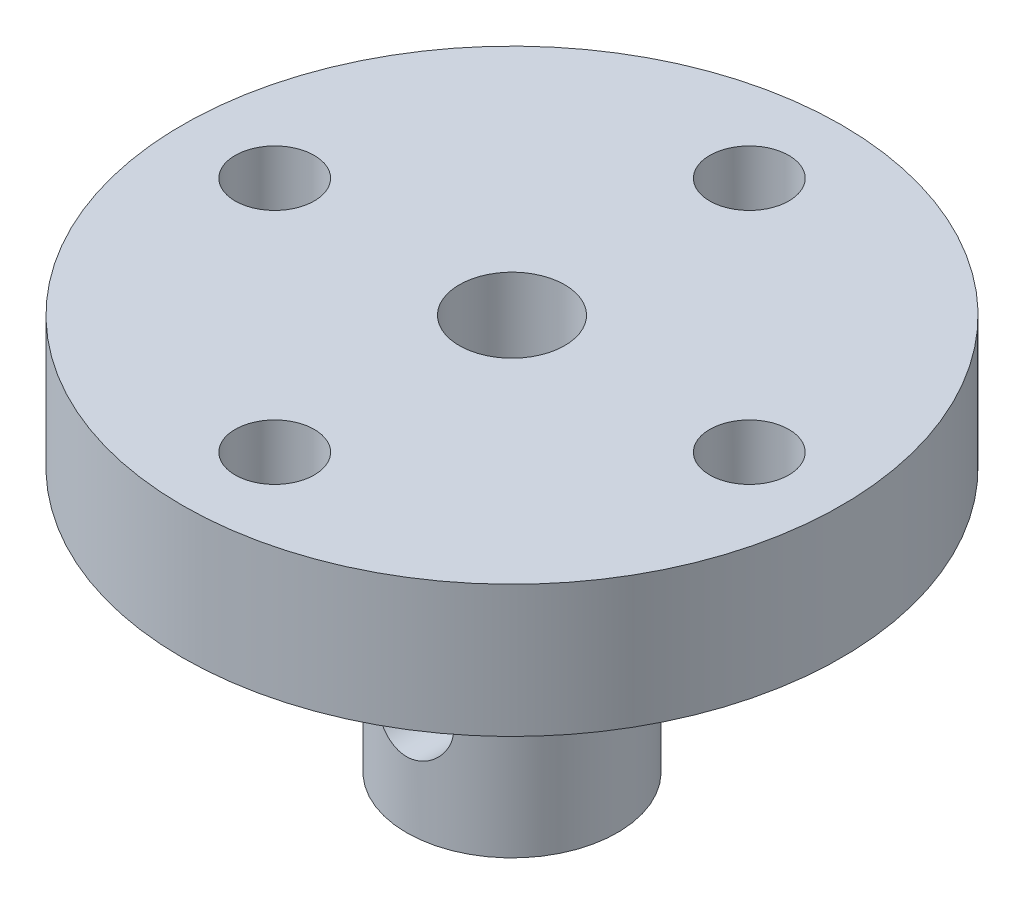
ISO-10303-21;
HEADER;
FILE_DESCRIPTION(('STEP AP214'),'2;1');
FILE_NAME('part.step','',(''),(''),'','','');
FILE_SCHEMA(('AUTOMOTIVE_DESIGN { 1 0 10303 214 1 1 1 1 }'));
ENDSEC;
DATA;
#1=APPLICATION_CONTEXT('core data for automotive mechanical design processes');
#2=APPLICATION_PROTOCOL_DEFINITION('international standard','automotive_design',2000,#1);
#3=PRODUCT_CONTEXT('',#1,'mechanical');
#4=PRODUCT('Part','Part','',(#3));
#5=PRODUCT_RELATED_PRODUCT_CATEGORY('part','',(#4));
#6=PRODUCT_DEFINITION_FORMATION('','',#4);
#7=PRODUCT_DEFINITION_CONTEXT('part definition',#1,'design');
#8=PRODUCT_DEFINITION('design','',#6,#7);
#9=PRODUCT_DEFINITION_SHAPE('','',#8);
#10=(LENGTH_UNIT() NAMED_UNIT(*) SI_UNIT(.MILLI.,.METRE.));
#11=(NAMED_UNIT(*) PLANE_ANGLE_UNIT() SI_UNIT($,.RADIAN.));
#12=(NAMED_UNIT(*) SI_UNIT($,.STERADIAN.) SOLID_ANGLE_UNIT());
#13=UNCERTAINTY_MEASURE_WITH_UNIT(LENGTH_MEASURE(1.E-05),#10,'distance_accuracy_value','');
#14=(GEOMETRIC_REPRESENTATION_CONTEXT(3) GLOBAL_UNCERTAINTY_ASSIGNED_CONTEXT((#13)) GLOBAL_UNIT_ASSIGNED_CONTEXT((#10,
#11,#12)) REPRESENTATION_CONTEXT('',''));
#15=CARTESIAN_POINT('',(0.,0.,0.));
#16=DIRECTION('',(0.,0.,1.));
#17=DIRECTION('',(1.,0.,0.));
#18=AXIS2_PLACEMENT_3D('',#15,#16,#17);
#19=CARTESIAN_POINT('',(0.,4.,-4.));
#20=DIRECTION('',(0.,0.,-1.));
#21=DIRECTION('',(-1.,0.,0.));
#22=AXIS2_PLACEMENT_3D('',#19,#20,#21);
#23=CYLINDRICAL_SURFACE('',#22,1.49999999999999);
#24=CARTESIAN_POINT('',(-1.49999999999999,4.,1.3228756555323));
#25=CARTESIAN_POINT('',(-1.49999219049447,4.06999742342563,1.32289190044096));
#26=CARTESIAN_POINT('',(-1.49504109074419,4.14004583431192,1.32856366615417));
#27=CARTESIAN_POINT('',(-1.47578333210408,4.27732985620948,1.34990644032802));
#28=CARTESIAN_POINT('',(-1.46144878565586,4.34455644501951,1.36560725168671));
#29=CARTESIAN_POINT('',(-1.42483838991845,4.47357984673838,1.40375127916871));
#30=CARTESIAN_POINT('',(-1.40267483444955,4.53543877676246,1.42609848244815));
#31=CARTESIAN_POINT('',(-1.35130655299362,4.65434545444519,1.47486455031268));
#32=CARTESIAN_POINT('',(-1.3221026780169,4.71139378246922,1.50128292264933));
#33=CARTESIAN_POINT('',(-1.25039909811053,4.83211279631659,1.56177312961147));
#34=CARTESIAN_POINT('',(-1.20639573950362,4.89466793422647,1.59628904009788));
#35=CARTESIAN_POINT('',(-1.10933596759307,5.01252546624227,1.66521164096379));
#36=CARTESIAN_POINT('',(-1.05626622282798,5.06781696482027,1.69961809339877));
#37=CARTESIAN_POINT('',(-0.929610192252505,5.18085873865546,1.77262582436251));
#38=CARTESIAN_POINT('',(-0.854047289142155,5.23680596671985,1.81064921229759));
#39=CARTESIAN_POINT('',(-0.691189714821933,5.33462220828283,1.87882809751632));
#40=CARTESIAN_POINT('',(-0.603923293836161,5.37652429746881,1.90900204180106));
#41=CARTESIAN_POINT('',(-0.44786902398364,5.43320768590294,1.95034258990248));
#42=CARTESIAN_POINT('',(-0.381446049692531,5.45235709597846,1.96449710921006));
#43=CARTESIAN_POINT('',(-0.245552609316537,5.48139011599674,1.98605635937555));
#44=CARTESIAN_POINT('',(-0.176084845995165,5.49128177610673,1.99346695432364));
#45=CARTESIAN_POINT('',(-0.0358650926220237,5.50122173386248,2.00091375578087));
#46=CARTESIAN_POINT('',(0.0348897591186426,5.50124445437643,2.00093080057495));
#47=CARTESIAN_POINT('',(0.175316156674039,5.4913820632197,1.99354206503066));
#48=CARTESIAN_POINT('',(0.24498744782223,5.48149465709185,1.98613456571337));
#49=CARTESIAN_POINT('',(0.378889193792653,5.45291894941012,1.96491377944411));
#50=CARTESIAN_POINT('',(0.443224268236297,5.43454367361292,1.9513285776568));
#51=CARTESIAN_POINT('',(0.567680485046398,5.39000435781776,1.91882278657017));
#52=CARTESIAN_POINT('',(0.627800705033636,5.36383861948683,1.89990103394193));
#53=CARTESIAN_POINT('',(0.74921692186473,5.30147038485468,1.85561045984504));
#54=CARTESIAN_POINT('',(0.809935384713599,5.26448790338123,1.82976540608097));
#55=CARTESIAN_POINT('',(0.924567250548284,5.18326629602948,1.77460702483739));
#56=CARTESIAN_POINT('',(0.97847478462122,5.13902098630009,1.74529074780453));
#57=CARTESIAN_POINT('',(1.08908204283329,5.03477665117905,1.6789376587236));
#58=CARTESIAN_POINT('',(1.14424493004784,4.97339078997359,1.64151655866368));
#59=CARTESIAN_POINT('',(1.24400875556227,4.84216541637805,1.5672595828377));
#60=CARTESIAN_POINT('',(1.28860466211476,4.77232190047493,1.53042399363524));
#61=CARTESIAN_POINT('',(1.358732064116,4.63901812975436,1.4681942599916));
#62=CARTESIAN_POINT('',(1.38628866868102,4.57701295469934,1.44197599789983));
#63=CARTESIAN_POINT('',(1.43319397108783,4.44793471858061,1.39536741257395));
#64=CARTESIAN_POINT('',(1.45256121808258,4.38087352030962,1.37496395320512));
#65=CARTESIAN_POINT('',(1.47902385350669,4.25631305600167,1.34640050620233));
#66=CARTESIAN_POINT('',(1.48779069496581,4.19955291788313,1.33661539556871));
#67=CARTESIAN_POINT('',(1.49871760619788,4.08464453382617,1.32435588438335));
#68=CARTESIAN_POINT('',(1.50088612873265,4.02649816009717,1.32187213058308));
#69=CARTESIAN_POINT('',(1.49845270115551,3.9105210082666,1.32462868790498));
#70=CARTESIAN_POINT('',(1.49384825899489,3.85269035419032,1.32987184207165));
#71=CARTESIAN_POINT('',(1.47822527271968,3.73892384755712,1.34721218775047));
#72=CARTESIAN_POINT('',(1.46719578056393,3.68299140205189,1.35932107727346));
#73=CARTESIAN_POINT('',(1.43413959562386,3.55366195506112,1.39427758287803));
#74=CARTESIAN_POINT('',(1.40954189769241,3.48156404608496,1.41944823697316));
#75=CARTESIAN_POINT('',(1.35088877838434,3.34369233635988,1.47537861079977));
#76=CARTESIAN_POINT('',(1.31681594335475,3.27793048270525,1.50614858477231));
#77=CARTESIAN_POINT('',(1.23869774116694,3.15065099195187,1.57108282375651));
#78=CARTESIAN_POINT('',(1.1943411006034,3.08936712378174,1.60532883846047));
#79=CARTESIAN_POINT('',(1.0968256291459,2.97399790363875,1.67347506272362));
#80=CARTESIAN_POINT('',(1.04366252194461,2.91991607201106,1.70737509574666));
#81=CARTESIAN_POINT('',(0.916234513829601,2.80872300837063,1.77960222623534));
#82=CARTESIAN_POINT('',(0.839896270946836,2.7535247611424,1.81728174165358));
#83=CARTESIAN_POINT('',(0.675551612651247,2.65737926654913,1.88453104769826));
#84=CARTESIAN_POINT('',(0.58757102997483,2.61640117541871,1.91411836052284));
#85=CARTESIAN_POINT('',(0.43075566149689,2.56156200855314,1.9541940640238));
#86=CARTESIAN_POINT('',(0.364250057327451,2.54324320672456,1.9677547802964));
#87=CARTESIAN_POINT('',(0.228364464964332,2.51587120369248,1.98810265589123));
#88=CARTESIAN_POINT('',(0.158987104561923,2.5068097184515,1.9948958710696));
#89=CARTESIAN_POINT('',(0.0191476059403803,2.4984836090714,2.00113566717062));
#90=CARTESIAN_POINT('',(-0.0513166925871055,2.49924198265176,2.00056500218907));
#91=CARTESIAN_POINT('',(-0.191009011030097,2.51056099130125,1.9920880324381));
#92=CARTESIAN_POINT('',(-0.260236696591305,2.52112423770749,1.98417977344351));
#93=CARTESIAN_POINT('',(-0.393521935254986,2.55097491616725,1.96203400925195));
#94=CARTESIAN_POINT('',(-0.457671236511456,2.57000018132156,1.94798690792879));
#95=CARTESIAN_POINT('',(-0.581661343097402,2.61578806561895,1.91462720575136));
#96=CARTESIAN_POINT('',(-0.641501223388827,2.64255233983093,1.89531347862386));
#97=CARTESIAN_POINT('',(-0.762547698766824,2.70627793759598,1.8501764221064));
#98=CARTESIAN_POINT('',(-0.823141236713429,2.7440509313596,1.8238635270758));
#99=CARTESIAN_POINT('',(-0.937414811724224,2.82686644055423,1.76785506075716));
#100=CARTESIAN_POINT('',(-0.991088412383383,2.87191563728607,1.73815638795657));
#101=CARTESIAN_POINT('',(-1.10112380660682,2.97800536656081,1.67106353042106));
#102=CARTESIAN_POINT('',(-1.15591691541996,3.04044639943993,1.63330922504697));
#103=CARTESIAN_POINT('',(-1.25475253429351,3.1738680718999,1.55866082463332));
#104=CARTESIAN_POINT('',(-1.29879110556729,3.24485182603659,1.52176704921891));
#105=CARTESIAN_POINT('',(-1.36695971301455,3.37888325059033,1.46049601449284));
#106=CARTESIAN_POINT('',(-1.39333526337998,3.44033498270658,1.43513625007637));
#107=CARTESIAN_POINT('',(-1.43805398028599,3.56808291305591,1.39032564651233));
#108=CARTESIAN_POINT('',(-1.45641847678343,3.63436569159547,1.37085915899696));
#109=CARTESIAN_POINT('',(-1.4799705775638,3.75078821959695,1.34532423383262));
#110=CARTESIAN_POINT('',(-1.48744249026866,3.79996707129048,1.3370013026568));
#111=CARTESIAN_POINT('',(-1.49745839072447,3.89942233303366,1.32577295392455));
#112=CARTESIAN_POINT('',(-1.50000561211713,3.94969800094373,1.32286398151146));
#113=CARTESIAN_POINT('',(-1.49999999999999,4.,1.3228756555323));
#114=B_SPLINE_CURVE_WITH_KNOTS('',3,(#24,#25,#26,#27,#28,#29,#30,#31,#32,#33,#34,#35,#36,#37,
#38,#39,#40,#41,#42,#43,#44,#45,#46,#47,#48,#49,#50,#51,#52,#53,#54,#55,#56,#57,#58,#59,#60,#61,
#62,#63,#64,#65,#66,#67,#68,#69,#70,#71,#72,#73,#74,#75,#76,#77,#78,#79,#80,#81,#82,#83,#84,#85,
#86,#87,#88,#89,#90,#91,#92,#93,#94,#95,#96,#97,#98,#99,#100,#101,#102,#103,#104,#105,#106,#107,
#108,#109,#110,#111,#112,#113),.UNSPECIFIED.,.T.,.F.,(4,2,2,2,2,2,2,2,2,2,2,2,2,2,2,2,2,2,2,2,2,
2,2,2,2,2,2,2,2,2,2,2,2,2,2,2,2,2,2,2,2,2,2,2,4),(0.,0.209731776684488,0.420089722582993,
0.627545385620138,0.834975984672342,1.08585208691168,1.33710031031849,1.63964848103537,
1.94147907444962,2.15227725277554,2.3628919587071,2.57405250727805,2.78526195641287,
2.98923755895049,3.19325766108668,3.41936844116893,3.64567274887661,3.916495172047,
4.18744629647931,4.40499409477194,4.62204646613004,4.79608005545899,4.9698906053819,
5.1437651232621,5.31793678696017,5.55730028202395,5.79710662639149,6.04543209090058,
6.29387849446616,6.59652499511461,6.89851088586562,7.10852896194424,7.31835893539178,
7.5286804110104,7.73905791773941,7.94332812691909,8.14764205379329,8.37510052489607,
8.60276905744641,8.87547580578151,9.14828228208527,9.36218279640831,9.57551025772695,
9.72632812073761,9.87704692032402),.UNSPECIFIED.);
#115=CARTESIAN_POINT('',(-1.49999999999999,4.,1.3228756555323));
#116=VERTEX_POINT('',#115);
#117=EDGE_CURVE('E80',#116,#116,#114,.T.);
#118=ORIENTED_EDGE('',*,*,#117,.T.);
#119=EDGE_LOOP('',(#118));
#120=FACE_BOUND('',#119,.T.);
#121=CARTESIAN_POINT('',(-1.49999999999999,4.,3.70809924354783));
#122=CARTESIAN_POINT('',(-1.50000304106108,4.08100748372079,3.70809640633806));
#123=CARTESIAN_POINT('',(-1.49341597549486,4.16199492250364,3.71078260240986));
#124=CARTESIAN_POINT('',(-1.46736187895467,4.3215280829132,3.72116159304967));
#125=CARTESIAN_POINT('',(-1.44789523373262,4.40007387759501,3.72885423767113));
#126=CARTESIAN_POINT('',(-1.39689657610573,4.55237537161352,3.748254802809));
#127=CARTESIAN_POINT('',(-1.36539347266348,4.62614205665108,3.75995309569261));
#128=CARTESIAN_POINT('',(-1.29131856742697,4.76737189681884,3.78603134206599));
#129=CARTESIAN_POINT('',(-1.24874344095038,4.83483315028252,3.80041210067323));
#130=CARTESIAN_POINT('',(-1.15146661374161,4.96489031162281,3.83103574665713));
#131=CARTESIAN_POINT('',(-1.09630381213306,5.02712852962939,3.84733341923604));
#132=CARTESIAN_POINT('',(-0.976395839778919,5.14172281467148,3.87949750628547));
#133=CARTESIAN_POINT('',(-0.911648630256673,5.19407677374185,3.89536382814785));
#134=CARTESIAN_POINT('',(-0.771694655177594,5.28913951229561,3.92552873936553));
#135=CARTESIAN_POINT('',(-0.696206947538022,5.33145947471585,3.93975561223506));
#136=CARTESIAN_POINT('',(-0.538555771965242,5.4026511725249,3.96438007973848));
#137=CARTESIAN_POINT('',(-0.456394630933532,5.43152757199197,3.97477900217006));
#138=CARTESIAN_POINT('',(-0.291489341676829,5.47375789577461,3.9901869710344));
#139=CARTESIAN_POINT('',(-0.208923197281593,5.48772762744045,3.99540915214774));
#140=CARTESIAN_POINT('',(-0.042464363794784,5.50172120094498,4.0006401410794));
#141=CARTESIAN_POINT('',(0.0414278850628346,5.5017495776187,4.00065064414902));
#142=CARTESIAN_POINT('',(0.203743543064476,5.48821823853482,3.99559265903894));
#143=CARTESIAN_POINT('',(0.2822321782669,5.47533070205118,3.99077541996683));
#144=CARTESIAN_POINT('',(0.43583921798439,5.43746408477444,3.97693274932263));
#145=CARTESIAN_POINT('',(0.510957383430297,5.41248414773795,3.96790701975578));
#146=CARTESIAN_POINT('',(0.656989017303102,5.35082954832415,3.94637769167531));
#147=CARTESIAN_POINT('',(0.727825392287307,5.31398999473158,3.93382539470077));
#148=CARTESIAN_POINT('',(0.862486607957556,5.2298079030706,3.90651310225279));
#149=CARTESIAN_POINT('',(0.926309176932319,5.18246197698239,3.8917523951284));
#150=CARTESIAN_POINT('',(1.04909048680093,5.07537271371681,3.86052529655816));
#151=CARTESIAN_POINT('',(1.10754614526348,5.01506608434957,3.84400963763883));
#152=CARTESIAN_POINT('',(1.21370395569342,4.88540700667843,3.81182460645722));
#153=CARTESIAN_POINT('',(1.26140340692899,4.81605229341335,3.79615544748847));
#154=CARTESIAN_POINT('',(1.34565611808151,4.66828053253717,3.76712703500336));
#155=CARTESIAN_POINT('',(1.3819384785183,4.58969650631393,3.75382677150277));
#156=CARTESIAN_POINT('',(1.440564644415,4.42690377483242,3.73172438629003));
#157=CARTESIAN_POINT('',(1.46291620605594,4.3426982284063,3.72291976205783));
#158=CARTESIAN_POINT('',(1.49190191709667,4.17602403768404,3.71139597222849));
#159=CARTESIAN_POINT('',(1.49933521158965,4.09371589446386,3.70836785241537));
#160=CARTESIAN_POINT('',(1.50057885636271,3.92899064325826,3.70786539525016));
#161=CARTESIAN_POINT('',(1.49439261093761,3.84657356764753,3.71038967003987));
#162=CARTESIAN_POINT('',(1.46929733520156,3.68807007771232,3.72039381629735));
#163=CARTESIAN_POINT('',(1.45100618334224,3.61186886423534,3.72763276216449));
#164=CARTESIAN_POINT('',(1.40299774640637,3.46365205527981,3.74596487046362));
#165=CARTESIAN_POINT('',(1.37327812034622,3.39163732083187,3.75705882250173));
#166=CARTESIAN_POINT('',(1.30200292275277,3.2508355619238,3.7823624311608));
#167=CARTESIAN_POINT('',(1.26004545177046,3.18227070786266,3.79667328892065));
#168=CARTESIAN_POINT('',(1.16591317862478,3.05287101827396,3.82662814294291));
#169=CARTESIAN_POINT('',(1.11373463696434,2.99203902537537,3.84227262594077));
#170=CARTESIAN_POINT('',(0.99672734090093,2.87583162680491,3.87433046553184));
#171=CARTESIAN_POINT('',(0.931306341491054,2.82104659123125,3.89072969357028));
#172=CARTESIAN_POINT('',(0.791797471753144,2.72316163241057,3.92149874963302));
#173=CARTESIAN_POINT('',(0.717709573322666,2.68006174705417,3.93586857107664));
#174=CARTESIAN_POINT('',(0.563016329468471,2.60705394380039,3.96094985704552));
#175=CARTESIAN_POINT('',(0.482434433064621,2.5771008762074,3.9716738133801));
#176=CARTESIAN_POINT('',(0.31688188752325,2.53134358615009,3.98829436712571));
#177=CARTESIAN_POINT('',(0.231913320723588,2.51553271457761,3.99419323299413));
#178=CARTESIAN_POINT('',(0.0653355852738122,2.49922559724518,4.00028407317073));
#179=CARTESIAN_POINT('',(-0.016180768060848,2.49789051694102,4.00078860953764));
#180=CARTESIAN_POINT('',(-0.178226786412426,2.5084151594454,3.99684889809223));
#181=CARTESIAN_POINT('',(-0.258756569245259,2.52027329088587,3.9924052471313));
#182=CARTESIAN_POINT('',(-0.414548248377127,2.55625885149363,3.97921089603771));
#183=CARTESIAN_POINT('',(-0.489890731068835,2.58007990587837,3.97056791378017));
#184=CARTESIAN_POINT('',(-0.635515473006389,2.63901001338437,3.9498778362099));
#185=CARTESIAN_POINT('',(-0.705796771275542,2.67412120330476,3.93783009655664));
#186=CARTESIAN_POINT('',(-0.842540176994411,2.75631394350482,3.91090618300074));
#187=CARTESIAN_POINT('',(-0.908717548846847,2.80383664051416,3.89593240108829));
#188=CARTESIAN_POINT('',(-1.03241734752336,2.90880783018761,3.86499507694844));
#189=CARTESIAN_POINT('',(-1.0899366712559,2.96625986580788,3.84903118274027));
#190=CARTESIAN_POINT('',(-1.19781214236195,3.09306413164507,3.81688129739175));
#191=CARTESIAN_POINT('',(-1.24762999816025,3.16288440215432,3.8007280534916));
#192=CARTESIAN_POINT('',(-1.33484709556843,3.31041586957333,3.77098325003638));
#193=CARTESIAN_POINT('',(-1.37224504878156,3.38812788405349,3.75739195631217));
#194=CARTESIAN_POINT('',(-1.4346588697426,3.55295568097541,3.73402269853266));
#195=CARTESIAN_POINT('',(-1.45906002899522,3.64033436651179,3.7244380329086));
#196=CARTESIAN_POINT('',(-1.49172356722078,3.81848527195579,3.71147994336316));
#197=CARTESIAN_POINT('',(-1.4999965933957,3.90925521270999,3.70810242179737));
#198=CARTESIAN_POINT('',(-1.49999999999999,4.,3.70809924354783));
#199=B_SPLINE_CURVE_WITH_KNOTS('',3,(#121,#122,#123,#124,#125,#126,#127,#128,#129,#130,#131,
#132,#133,#134,#135,#136,#137,#138,#139,#140,#141,#142,#143,#144,#145,#146,#147,#148,#149,#150,
#151,#152,#153,#154,#155,#156,#157,#158,#159,#160,#161,#162,#163,#164,#165,#166,#167,#168,#169,
#170,#171,#172,#173,#174,#175,#176,#177,#178,#179,#180,#181,#182,#183,#184,#185,#186,#187,#188,
#189,#190,#191,#192,#193,#194,#195,#196,#197,#198),.UNSPECIFIED.,.T.,.F.,(4,2,2,2,2,2,2,2,2,2,2,
2,2,2,2,2,2,2,2,2,2,2,2,2,2,2,2,2,2,2,2,2,2,2,2,2,2,2,4),(0.,0.242684541416169,
0.485361814598852,0.727459856757027,0.969630679682929,1.22274652401127,1.47591628822982,
1.7377007213642,1.99939426381329,2.24980018489678,2.50012465404856,2.73806472803193,
2.97602165263334,3.21744131210666,3.45893893628974,3.71456675065873,3.97025867827333,
4.23162592252964,4.49284751635472,4.73965657740483,4.98640395388882,5.22143845928196,
5.45652113429523,5.70041561005818,5.94439948466352,6.20385016993621,6.46330169650174,
6.72185508890165,6.98028685560123,7.22365720549932,7.46699820319476,7.70440274003886,
7.94185223512827,8.18928323676982,8.4368027089496,8.69738599542074,8.95799630544237,
9.23003178870921,9.50188762323048),.UNSPECIFIED.);
#200=CARTESIAN_POINT('',(-1.49999999999999,4.,3.70809924354783));
#201=VERTEX_POINT('',#200);
#202=EDGE_CURVE('E53',#201,#201,#199,.T.);
#203=ORIENTED_EDGE('',*,*,#202,.F.);
#204=EDGE_LOOP('',(#203));
#205=FACE_BOUND('',#204,.T.);
#206=ADVANCED_FACE('F31',(#120,#205),#23,.F.);
#207=CARTESIAN_POINT('',(0.,10.,0.));
#208=DIRECTION('',(0.,-1.,0.));
#209=DIRECTION('',(0.,0.,-1.));
#210=AXIS2_PLACEMENT_3D('',#207,#208,#209);
#211=CYLINDRICAL_SURFACE('',#210,4.);
#212=CARTESIAN_POINT('',(0.,5.49999999999999,-4.));
#213=CARTESIAN_POINT('',(-0.0812350589378525,5.5000029023031,-4.00000217456151));
#214=CARTESIAN_POINT('',(-0.162450241781791,5.49338023975161,-3.99750379283184));
#215=CARTESIAN_POINT('',(-0.322453452352359,5.46717180473006,-3.98778696006928));
#216=CARTESIAN_POINT('',(-0.401241827987614,5.44758789952942,-3.98056918893993));
#217=CARTESIAN_POINT('',(-0.554060784990876,5.39624699822823,-3.96218832391545));
#218=CARTESIAN_POINT('',(-0.628100224162275,5.36451348317821,-3.9510328434944));
#219=CARTESIAN_POINT('',(-0.76979931016025,5.28989358698417,-3.92588767765353));
#220=CARTESIAN_POINT('',(-0.837457239177875,5.24700421445584,-3.91189723227548));
#221=CARTESIAN_POINT('',(-0.96734641704582,5.14938746892908,-3.88186246971217));
#222=CARTESIAN_POINT('',(-1.02927073015119,5.09426973774059,-3.86576002583566));
#223=CARTESIAN_POINT('',(-1.14324421474362,4.97458956534115,-3.83360220871327));
#224=CARTESIAN_POINT('',(-1.19529036359202,4.91002424391212,-3.81754685135033));
#225=CARTESIAN_POINT('',(-1.28998202215984,4.77028253247678,-3.78662470617732));
#226=CARTESIAN_POINT('',(-1.33219393195759,4.69479563345418,-3.77182648820819));
#227=CARTESIAN_POINT('',(-1.40318646334084,4.53715164583147,-3.74599860237434));
#228=CARTESIAN_POINT('',(-1.43197244961238,4.45499723684489,-3.73496742975881));
#229=CARTESIAN_POINT('',(-1.47408431017548,4.2898832597418,-3.71854412824136));
#230=CARTESIAN_POINT('',(-1.48799593218557,4.20709496156456,-3.71293924350838));
#231=CARTESIAN_POINT('',(-1.50179556531647,4.04018384200616,-3.70738061461215));
#232=CARTESIAN_POINT('',(-1.5016893680263,3.95606158612553,-3.70742453659305));
#233=CARTESIAN_POINT('',(-1.48790429610017,3.79423047478704,-3.71297511632055));
#234=CARTESIAN_POINT('',(-1.47503808509003,3.71643909395582,-3.71815468871122));
#235=CARTESIAN_POINT('',(-1.43744167868329,3.56421284959468,-3.7328493805953));
#236=CARTESIAN_POINT('',(-1.41270969663258,3.48977849338612,-3.74236515298863));
#237=CARTESIAN_POINT('',(-1.35163748571903,3.34472293227177,-3.76485702190253));
#238=CARTESIAN_POINT('',(-1.315086487371,3.2742005138787,-3.77789517988166));
#239=CARTESIAN_POINT('',(-1.23156073762697,3.14005426240903,-3.8059421013932));
#240=CARTESIAN_POINT('',(-1.18458238728896,3.0764328224803,-3.82095154457158));
#241=CARTESIAN_POINT('',(-1.07781780766548,2.95339633634913,-3.85248038859113));
#242=CARTESIAN_POINT('',(-1.01738298716955,2.89455135925191,-3.86903347455671));
#243=CARTESIAN_POINT('',(-0.887312590819015,2.78766203379421,-3.90091728164086));
#244=CARTESIAN_POINT('',(-0.817675603497359,2.73961934539433,-3.91624781465952));
#245=CARTESIAN_POINT('',(-0.669723436992415,2.65506960293749,-3.9442639480908));
#246=CARTESIAN_POINT('',(-0.591290713844715,2.61875241877895,-3.95690498259616));
#247=CARTESIAN_POINT('',(-0.42883685052458,2.56001739572997,-3.97778718326962));
#248=CARTESIAN_POINT('',(-0.344818210845765,2.53759338343889,-3.98603030341493));
#249=CARTESIAN_POINT('',(-0.178375243148664,2.50837721245807,-3.99684443228065));
#250=CARTESIAN_POINT('',(-0.0961036195622084,2.5008173936175,-3.99969369025686));
#251=CARTESIAN_POINT('',(0.0685724752550243,2.49930893610009,-4.00025893700126));
#252=CARTESIAN_POINT('',(0.150976912983373,2.50535727968323,-3.99797606386863));
#253=CARTESIAN_POINT('',(0.310262048561859,2.53031004230868,-3.98871709772643));
#254=CARTESIAN_POINT('',(0.387233328007335,2.54871154373709,-3.98192470962305));
#255=CARTESIAN_POINT('',(0.536941754957219,2.59718607254733,-3.96451477091717));
#256=CARTESIAN_POINT('',(0.609678350347532,2.62726061794804,-3.9538967228203));
#257=CARTESIAN_POINT('',(0.751247765110153,2.69918641243948,-3.92949624407682));
#258=CARTESIAN_POINT('',(0.819903083557792,2.74135772922339,-3.91563000209348));
#259=CARTESIAN_POINT('',(0.949392711726621,2.83591810317156,-3.88626671564664));
#260=CARTESIAN_POINT('',(1.01022412027045,2.88831093254516,-3.87076907009516));
#261=CARTESIAN_POINT('',(1.12603079874454,3.00540412212428,-3.8387332949099));
#262=CARTESIAN_POINT('',(1.18046154123568,3.0706421827727,-3.82218696503729));
#263=CARTESIAN_POINT('',(1.27771050031903,3.20965138470766,-3.79078815746854));
#264=CARTESIAN_POINT('',(1.32052767414518,3.28342329138851,-3.775935831944));
#265=CARTESIAN_POINT('',(1.39337773518997,3.43801598677232,-3.74966829822464));
#266=CARTESIAN_POINT('',(1.42335685446917,3.51886474591044,-3.73826760328494));
#267=CARTESIAN_POINT('',(1.46907883466888,3.68500976368783,-3.72054032891005));
#268=CARTESIAN_POINT('',(1.48483050305534,3.77030323619813,-3.71421061057491));
#269=CARTESIAN_POINT('',(1.50086347097838,3.93701615954112,-3.70775894792574));
#270=CARTESIAN_POINT('',(1.50207331495837,4.01833263171689,-3.70726444523341));
#271=CARTESIAN_POINT('',(1.49136715641592,4.17994531627617,-3.71158412745292));
#272=CARTESIAN_POINT('',(1.47945239850123,4.26024162467158,-3.71639780898899));
#273=CARTESIAN_POINT('',(1.44355815630241,4.41504722671655,-3.73048141585433));
#274=CARTESIAN_POINT('',(1.41995798316523,4.48965834624534,-3.73961085376663));
#275=CARTESIAN_POINT('',(1.36169696779919,4.63390550849442,-3.76121548297845));
#276=CARTESIAN_POINT('',(1.32703332944944,4.70354028807014,-3.77369151995215));
#277=CARTESIAN_POINT('',(1.24552075938153,4.83982678969763,-3.80139723903965));
#278=CARTESIAN_POINT('',(1.19812832803009,4.90613079679991,-3.81673698440964));
#279=CARTESIAN_POINT('',(1.09334485729905,5.0301415609712,-3.84806246757177));
#280=CARTESIAN_POINT('',(1.03595064012807,5.08784557478675,-3.86404840943145));
#281=CARTESIAN_POINT('',(0.909080396784615,5.19620195582184,-3.89590424609881));
#282=CARTESIAN_POINT('',(0.839118644212985,5.24630375343467,-3.91172104900645));
#283=CARTESIAN_POINT('',(0.691213223200814,5.33402265527655,-3.94054514457031));
#284=CARTESIAN_POINT('',(0.613268934090615,5.37163878773636,-3.95355221851559));
#285=CARTESIAN_POINT('',(0.447999082002307,5.43437682904832,-3.9757429260668));
#286=CARTESIAN_POINT('',(0.360413422234205,5.45888706460189,-3.98473657158356));
#287=CARTESIAN_POINT('',(0.181875733606381,5.49169295992067,-3.99686242179587));
#288=CARTESIAN_POINT('',(0.0909254163648583,5.49999675148732,-3.99999756603967));
#289=CARTESIAN_POINT('',(0.,5.49999999999999,-4.));
#290=B_SPLINE_CURVE_WITH_KNOTS('',3,(#212,#213,#214,#215,#216,#217,#218,#219,#220,#221,#222,
#223,#224,#225,#226,#227,#228,#229,#230,#231,#232,#233,#234,#235,#236,#237,#238,#239,#240,#241,
#242,#243,#244,#245,#246,#247,#248,#249,#250,#251,#252,#253,#254,#255,#256,#257,#258,#259,#260,
#261,#262,#263,#264,#265,#266,#267,#268,#269,#270,#271,#272,#273,#274,#275,#276,#277,#278,#279,
#280,#281,#282,#283,#284,#285,#286,#287,#288,#289),.UNSPECIFIED.,.T.,.F.,(4,2,2,2,2,2,2,2,2,2,2,
2,2,2,2,2,2,2,2,2,2,2,2,2,2,2,2,2,2,2,2,2,2,2,2,2,2,2,4),(0.,0.243369801560558,
0.486704549530458,0.72957136921357,0.972503379609485,1.22473618582715,1.47704604925621,
1.73896674501658,2.00078269352133,2.251858744169,2.50283106079706,2.7387834511997,
2.97477138060587,3.21522408387016,3.45575990744257,3.71246153335811,3.96920257905064,
4.22991375286073,4.49050899698843,4.73725019635923,4.98393668390518,5.22114437923837,
5.45838293254451,5.70259221859596,5.94689180019864,6.20536519455654,6.46386178920137,
6.723430667272,6.98283874956503,7.22558763480248,7.46831350211255,7.70363142426529,
7.93900886656502,8.18672471884267,8.43451941997057,8.69572329654034,8.95694749805097,
9.22948515032037,9.50188601796122),.UNSPECIFIED.);
#291=CARTESIAN_POINT('',(0.,5.49999999999999,-4.));
#292=VERTEX_POINT('',#291);
#293=EDGE_CURVE('E10',#292,#292,#290,.T.);
#294=ORIENTED_EDGE('',*,*,#293,.T.);
#295=EDGE_LOOP('',(#294));
#296=FACE_BOUND('',#295,.T.);
#297=ORIENTED_EDGE('',*,*,#202,.T.);
#298=EDGE_LOOP('',(#297));
#299=FACE_BOUND('',#298,.T.);
#300=CARTESIAN_POINT('',(0.,10.,0.));
#301=DIRECTION('',(0.,1.,0.));
#302=DIRECTION('',(0.,0.,1.));
#303=AXIS2_PLACEMENT_3D('',#300,#301,#302);
#304=CIRCLE('',#303,4.);
#305=CARTESIAN_POINT('',(0.,10.,4.));
#306=VERTEX_POINT('',#305);
#307=EDGE_CURVE('E40',#306,#306,#304,.T.);
#308=ORIENTED_EDGE('',*,*,#307,.F.);
#309=EDGE_LOOP('',(#308));
#310=FACE_BOUND('',#309,.T.);
#311=CARTESIAN_POINT('',(0.,0.,0.));
#312=DIRECTION('',(0.,1.,0.));
#313=DIRECTION('',(0.,0.,1.));
#314=AXIS2_PLACEMENT_3D('',#311,#312,#313);
#315=CIRCLE('',#314,4.);
#316=CARTESIAN_POINT('',(0.,0.,4.));
#317=VERTEX_POINT('',#316);
#318=EDGE_CURVE('E45',#317,#317,#315,.T.);
#319=ORIENTED_EDGE('',*,*,#318,.T.);
#320=EDGE_LOOP('',(#319));
#321=FACE_BOUND('',#320,.T.);
#322=ADVANCED_FACE('F33',(#296,#299,#310,#321),#211,.T.);
#323=CARTESIAN_POINT('',(0.,0.,0.));
#324=DIRECTION('',(0.,1.,0.));
#325=DIRECTION('',(0.,0.,1.));
#326=AXIS2_PLACEMENT_3D('',#323,#324,#325);
#327=PLANE('',#326);
#328=CARTESIAN_POINT('',(0.,0.,0.));
#329=DIRECTION('',(0.,-1.,0.));
#330=DIRECTION('',(0.,0.,-1.));
#331=AXIS2_PLACEMENT_3D('',#328,#329,#330);
#332=CIRCLE('',#331,2.);
#333=CARTESIAN_POINT('',(0.,0.,-2.));
#334=VERTEX_POINT('',#333);
#335=EDGE_CURVE('E133',#334,#334,#332,.T.);
#336=ORIENTED_EDGE('',*,*,#335,.F.);
#337=EDGE_LOOP('',(#336));
#338=FACE_BOUND('',#337,.T.);
#339=ORIENTED_EDGE('',*,*,#318,.F.);
#340=EDGE_LOOP('',(#339));
#341=FACE_BOUND('',#340,.T.);
#342=ADVANCED_FACE('F112',(#338,#341),#327,.F.);
#343=CARTESIAN_POINT('',(0.,15.,0.));
#344=DIRECTION('',(0.,-1.,0.));
#345=DIRECTION('',(0.,0.,-1.));
#346=AXIS2_PLACEMENT_3D('',#343,#344,#345);
#347=CYLINDRICAL_SURFACE('',#346,12.5);
#348=CARTESIAN_POINT('',(0.,15.,0.));
#349=DIRECTION('',(0.,1.,0.));
#350=DIRECTION('',(0.,0.,1.));
#351=AXIS2_PLACEMENT_3D('',#348,#349,#350);
#352=CIRCLE('',#351,12.5);
#353=CARTESIAN_POINT('',(0.,15.,12.5));
#354=VERTEX_POINT('',#353);
#355=EDGE_CURVE('E121',#354,#354,#352,.T.);
#356=ORIENTED_EDGE('',*,*,#355,.F.);
#357=EDGE_LOOP('',(#356));
#358=FACE_BOUND('',#357,.T.);
#359=CARTESIAN_POINT('',(0.,10.,0.));
#360=DIRECTION('',(0.,1.,0.));
#361=DIRECTION('',(0.,0.,1.));
#362=AXIS2_PLACEMENT_3D('',#359,#360,#361);
#363=CIRCLE('',#362,12.5);
#364=CARTESIAN_POINT('',(0.,10.,12.5));
#365=VERTEX_POINT('',#364);
#366=EDGE_CURVE('E119',#365,#365,#363,.T.);
#367=ORIENTED_EDGE('',*,*,#366,.T.);
#368=EDGE_LOOP('',(#367));
#369=FACE_BOUND('',#368,.T.);
#370=ADVANCED_FACE('F141',(#358,#369),#347,.T.);
#371=CARTESIAN_POINT('',(0.,15.,0.));
#372=DIRECTION('',(0.,1.,0.));
#373=DIRECTION('',(0.,0.,1.));
#374=AXIS2_PLACEMENT_3D('',#371,#372,#373);
#375=PLANE('',#374);
#376=CARTESIAN_POINT('',(0.,15.,9.));
#377=DIRECTION('',(0.,1.,0.));
#378=DIRECTION('',(1.,0.,0.));
#379=AXIS2_PLACEMENT_3D('',#376,#377,#378);
#380=CIRCLE('',#379,1.5);
#381=CARTESIAN_POINT('',(1.50000000000003,15.,8.99999999999999));
#382=VERTEX_POINT('',#381);
#383=EDGE_CURVE('E172',#382,#382,#380,.T.);
#384=ORIENTED_EDGE('',*,*,#383,.F.);
#385=EDGE_LOOP('',(#384));
#386=FACE_BOUND('',#385,.T.);
#387=CARTESIAN_POINT('',(9.,15.,0.));
#388=DIRECTION('',(0.,1.,0.));
#389=DIRECTION('',(0.,0.,-1.));
#390=AXIS2_PLACEMENT_3D('',#387,#388,#389);
#391=CIRCLE('',#390,1.5);
#392=CARTESIAN_POINT('',(9.,15.,-1.5));
#393=VERTEX_POINT('',#392);
#394=EDGE_CURVE('E173',#393,#393,#391,.T.);
#395=ORIENTED_EDGE('',*,*,#394,.F.);
#396=EDGE_LOOP('',(#395));
#397=FACE_BOUND('',#396,.T.);
#398=CARTESIAN_POINT('',(0.,15.,-9.));
#399=DIRECTION('',(0.,1.,0.));
#400=DIRECTION('',(-1.,0.,0.));
#401=AXIS2_PLACEMENT_3D('',#398,#399,#400);
#402=CIRCLE('',#401,1.5);
#403=CARTESIAN_POINT('',(-1.50000000000009,15.,-8.99999999999998));
#404=VERTEX_POINT('',#403);
#405=EDGE_CURVE('E177',#404,#404,#402,.T.);
#406=ORIENTED_EDGE('',*,*,#405,.F.);
#407=EDGE_LOOP('',(#406));
#408=FACE_BOUND('',#407,.T.);
#409=CARTESIAN_POINT('',(0.,15.,0.));
#410=DIRECTION('',(0.,-1.,0.));
#411=DIRECTION('',(0.,0.,-1.));
#412=AXIS2_PLACEMENT_3D('',#409,#410,#411);
#413=CIRCLE('',#412,2.);
#414=CARTESIAN_POINT('',(0.,15.,-2.));
#415=VERTEX_POINT('',#414);
#416=EDGE_CURVE('E81',#415,#415,#413,.T.);
#417=ORIENTED_EDGE('',*,*,#416,.T.);
#418=EDGE_LOOP('',(#417));
#419=FACE_BOUND('',#418,.T.);
#420=CARTESIAN_POINT('',(-9.,15.,0.));
#421=DIRECTION('',(0.,1.,0.));
#422=DIRECTION('',(0.,0.,1.));
#423=AXIS2_PLACEMENT_3D('',#420,#421,#422);
#424=CIRCLE('',#423,1.5);
#425=CARTESIAN_POINT('',(-9.,15.,1.5));
#426=VERTEX_POINT('',#425);
#427=EDGE_CURVE('E124',#426,#426,#424,.T.);
#428=ORIENTED_EDGE('',*,*,#427,.F.);
#429=EDGE_LOOP('',(#428));
#430=FACE_BOUND('',#429,.T.);
#431=ORIENTED_EDGE('',*,*,#355,.T.);
#432=EDGE_LOOP('',(#431));
#433=FACE_BOUND('',#432,.T.);
#434=ADVANCED_FACE('F69',(#386,#397,#408,#419,#430,#433),#375,.T.);
#435=CARTESIAN_POINT('',(0.,10.,0.));
#436=DIRECTION('',(0.,1.,0.));
#437=DIRECTION('',(0.,0.,1.));
#438=AXIS2_PLACEMENT_3D('',#435,#436,#437);
#439=PLANE('',#438);
#440=CARTESIAN_POINT('',(0.,10.,9.));
#441=DIRECTION('',(0.,1.,0.));
#442=DIRECTION('',(0.,0.,1.));
#443=AXIS2_PLACEMENT_3D('',#440,#441,#442);
#444=CIRCLE('',#443,1.5);
#445=CARTESIAN_POINT('',(0.,10.,10.5));
#446=VERTEX_POINT('',#445);
#447=EDGE_CURVE('E36',#446,#446,#444,.T.);
#448=ORIENTED_EDGE('',*,*,#447,.T.);
#449=EDGE_LOOP('',(#448));
#450=FACE_BOUND('',#449,.T.);
#451=CARTESIAN_POINT('',(9.,10.,0.));
#452=DIRECTION('',(0.,1.,0.));
#453=DIRECTION('',(0.,0.,1.));
#454=AXIS2_PLACEMENT_3D('',#451,#452,#453);
#455=CIRCLE('',#454,1.5);
#456=CARTESIAN_POINT('',(9.,10.,1.5));
#457=VERTEX_POINT('',#456);
#458=EDGE_CURVE('E161',#457,#457,#455,.T.);
#459=ORIENTED_EDGE('',*,*,#458,.T.);
#460=EDGE_LOOP('',(#459));
#461=FACE_BOUND('',#460,.T.);
#462=CARTESIAN_POINT('',(0.,10.,-9.));
#463=DIRECTION('',(0.,1.,0.));
#464=DIRECTION('',(0.,0.,1.));
#465=AXIS2_PLACEMENT_3D('',#462,#463,#464);
#466=CIRCLE('',#465,1.5);
#467=CARTESIAN_POINT('',(0.,10.,-7.5));
#468=VERTEX_POINT('',#467);
#469=EDGE_CURVE('E164',#468,#468,#466,.T.);
#470=ORIENTED_EDGE('',*,*,#469,.T.);
#471=EDGE_LOOP('',(#470));
#472=FACE_BOUND('',#471,.T.);
#473=CARTESIAN_POINT('',(-9.,10.,0.));
#474=DIRECTION('',(0.,1.,0.));
#475=DIRECTION('',(0.,0.,1.));
#476=AXIS2_PLACEMENT_3D('',#473,#474,#475);
#477=CIRCLE('',#476,1.5);
#478=CARTESIAN_POINT('',(-9.,10.,1.5));
#479=VERTEX_POINT('',#478);
#480=EDGE_CURVE('E58',#479,#479,#477,.T.);
#481=ORIENTED_EDGE('',*,*,#480,.T.);
#482=EDGE_LOOP('',(#481));
#483=FACE_BOUND('',#482,.T.);
#484=ORIENTED_EDGE('',*,*,#307,.T.);
#485=EDGE_LOOP('',(#484));
#486=FACE_BOUND('',#485,.T.);
#487=ORIENTED_EDGE('',*,*,#366,.F.);
#488=EDGE_LOOP('',(#487));
#489=FACE_BOUND('',#488,.T.);
#490=ADVANCED_FACE('F66',(#450,#461,#472,#483,#486,#489),#439,.F.);
#491=CARTESIAN_POINT('',(-1.49999999999999,4.,-1.3228756555323));
#492=CARTESIAN_POINT('',(-1.49999219049447,3.93000257657437,-1.32289190044096));
#493=CARTESIAN_POINT('',(-1.49504109074419,3.85995416568808,-1.32856366615417));
#494=CARTESIAN_POINT('',(-1.47578333210408,3.72267014379052,-1.34990644032802));
#495=CARTESIAN_POINT('',(-1.46144878565586,3.65544355498049,-1.36560725168671));
#496=CARTESIAN_POINT('',(-1.42483838991845,3.52642015326162,-1.40375127916871));
#497=CARTESIAN_POINT('',(-1.40267483444955,3.46456122323754,-1.42609848244815));
#498=CARTESIAN_POINT('',(-1.35130655299362,3.34565454555481,-1.47486455031268));
#499=CARTESIAN_POINT('',(-1.3221026780169,3.28860621753078,-1.50128292264932));
#500=CARTESIAN_POINT('',(-1.25039909811053,3.16788720368341,-1.56177312961147));
#501=CARTESIAN_POINT('',(-1.20639573950362,3.10533206577353,-1.59628904009788));
#502=CARTESIAN_POINT('',(-1.10933596759307,2.98747453375773,-1.66521164096379));
#503=CARTESIAN_POINT('',(-1.05626622282798,2.93218303517973,-1.69961809339877));
#504=CARTESIAN_POINT('',(-0.929610192252506,2.81914126134454,-1.77262582436251));
#505=CARTESIAN_POINT('',(-0.854047289142156,2.76319403328015,-1.81064921229759));
#506=CARTESIAN_POINT('',(-0.691189714821933,2.66537779171717,-1.87882809751632));
#507=CARTESIAN_POINT('',(-0.603923293836161,2.62347570253119,-1.90900204180106));
#508=CARTESIAN_POINT('',(-0.44786902398364,2.56679231409706,-1.95034258990248));
#509=CARTESIAN_POINT('',(-0.381446049692531,2.54764290402154,-1.96449710921006));
#510=CARTESIAN_POINT('',(-0.245552609316537,2.51860988400326,-1.98605635937555));
#511=CARTESIAN_POINT('',(-0.176084845995165,2.50871822389327,-1.99346695432364));
#512=CARTESIAN_POINT('',(-0.035865092622024,2.49877826613752,-2.00091375578087));
#513=CARTESIAN_POINT('',(0.0348897591186423,2.49875554562357,-2.00093080057495));
#514=CARTESIAN_POINT('',(0.175316156674039,2.5086179367803,-1.99354206503066));
#515=CARTESIAN_POINT('',(0.244987447822229,2.51850534290815,-1.98613456571337));
#516=CARTESIAN_POINT('',(0.378889193792653,2.54708105058988,-1.96491377944411));
#517=CARTESIAN_POINT('',(0.443224268236297,2.56545632638708,-1.9513285776568));
#518=CARTESIAN_POINT('',(0.567680485046397,2.60999564218224,-1.91882278657017));
#519=CARTESIAN_POINT('',(0.627800705033636,2.63616138051317,-1.89990103394193));
#520=CARTESIAN_POINT('',(0.74921692186473,2.69852961514532,-1.85561045984504));
#521=CARTESIAN_POINT('',(0.809935384713598,2.73551209661877,-1.82976540608097));
#522=CARTESIAN_POINT('',(0.924567250548283,2.81673370397052,-1.77460702483739));
#523=CARTESIAN_POINT('',(0.978474784621219,2.86097901369991,-1.74529074780454));
#524=CARTESIAN_POINT('',(1.08908204283329,2.96522334882095,-1.6789376587236));
#525=CARTESIAN_POINT('',(1.14424493004784,3.02660921002641,-1.64151655866368));
#526=CARTESIAN_POINT('',(1.24400875556227,3.15783458362195,-1.5672595828377));
#527=CARTESIAN_POINT('',(1.28860466211476,3.22767809952507,-1.53042399363524));
#528=CARTESIAN_POINT('',(1.358732064116,3.36098187024564,-1.4681942599916));
#529=CARTESIAN_POINT('',(1.38628866868102,3.42298704530066,-1.44197599789983));
#530=CARTESIAN_POINT('',(1.43319397108783,3.55206528141939,-1.39536741257395));
#531=CARTESIAN_POINT('',(1.45256121808258,3.61912647969038,-1.37496395320512));
#532=CARTESIAN_POINT('',(1.47902385350669,3.74368694399833,-1.34640050620233));
#533=CARTESIAN_POINT('',(1.48779069496581,3.80044708211687,-1.33661539556871));
#534=CARTESIAN_POINT('',(1.49871760619788,3.91535546617383,-1.32435588438335));
#535=CARTESIAN_POINT('',(1.50088612873265,3.97350183990283,-1.32187213058308));
#536=CARTESIAN_POINT('',(1.49845270115551,4.08947899173341,-1.32462868790498));
#537=CARTESIAN_POINT('',(1.49384825899489,4.14730964580968,-1.32987184207165));
#538=CARTESIAN_POINT('',(1.47822527271968,4.26107615244288,-1.34721218775047));
#539=CARTESIAN_POINT('',(1.46719578056393,4.31700859794811,-1.35932107727346));
#540=CARTESIAN_POINT('',(1.43413959562386,4.44633804493888,-1.39427758287803));
#541=CARTESIAN_POINT('',(1.40954189769241,4.51843595391504,-1.41944823697316));
#542=CARTESIAN_POINT('',(1.35088877838434,4.65630766364012,-1.47537861079977));
#543=CARTESIAN_POINT('',(1.31681594335475,4.72206951729476,-1.50614858477231));
#544=CARTESIAN_POINT('',(1.23869774116694,4.84934900804813,-1.57108282375651));
#545=CARTESIAN_POINT('',(1.1943411006034,4.91063287621826,-1.60532883846047));
#546=CARTESIAN_POINT('',(1.0968256291459,5.02600209636126,-1.67347506272362));
#547=CARTESIAN_POINT('',(1.04366252194461,5.08008392798894,-1.70737509574666));
#548=CARTESIAN_POINT('',(0.916234513829599,5.19127699162937,-1.77960222623534));
#549=CARTESIAN_POINT('',(0.839896270946834,5.2464752388576,-1.81728174165358));
#550=CARTESIAN_POINT('',(0.675551612651244,5.34262073345087,-1.88453104769826));
#551=CARTESIAN_POINT('',(0.587571029974828,5.38359882458129,-1.91411836052284));
#552=CARTESIAN_POINT('',(0.430755661496887,5.43843799144687,-1.9541940640238));
#553=CARTESIAN_POINT('',(0.364250057327449,5.45675679327544,-1.9677547802964));
#554=CARTESIAN_POINT('',(0.228364464964329,5.48412879630752,-1.98810265589123));
#555=CARTESIAN_POINT('',(0.158987104561921,5.4931902815485,-1.9948958710696));
#556=CARTESIAN_POINT('',(0.0191476059403777,5.5015163909286,-2.00113566717063));
#557=CARTESIAN_POINT('',(-0.051316692587108,5.50075801734824,-2.00056500218907));
#558=CARTESIAN_POINT('',(-0.1910090110301,5.48943900869875,-1.9920880324381));
#559=CARTESIAN_POINT('',(-0.260236696591307,5.47887576229251,-1.98417977344351));
#560=CARTESIAN_POINT('',(-0.393521935254988,5.44902508383275,-1.96203400925195));
#561=CARTESIAN_POINT('',(-0.457671236511458,5.42999981867843,-1.94798690792878));
#562=CARTESIAN_POINT('',(-0.581661343097404,5.38421193438104,-1.91462720575136));
#563=CARTESIAN_POINT('',(-0.641501223388829,5.35744766016907,-1.89531347862386));
#564=CARTESIAN_POINT('',(-0.762547698766826,5.29372206240402,-1.8501764221064));
#565=CARTESIAN_POINT('',(-0.823141236713431,5.2559490686404,-1.8238635270758));
#566=CARTESIAN_POINT('',(-0.937414811724227,5.17313355944577,-1.76785506075716));
#567=CARTESIAN_POINT('',(-0.991088412383385,5.12808436271393,-1.73815638795657));
#568=CARTESIAN_POINT('',(-1.10112380660682,5.02199463343918,-1.67106353042106));
#569=CARTESIAN_POINT('',(-1.15591691541996,4.95955360056007,-1.63330922504696));
#570=CARTESIAN_POINT('',(-1.25475253429351,4.8261319281001,-1.55866082463332));
#571=CARTESIAN_POINT('',(-1.29879110556729,4.75514817396341,-1.52176704921891));
#572=CARTESIAN_POINT('',(-1.36695971301455,4.62111674940966,-1.46049601449284));
#573=CARTESIAN_POINT('',(-1.39333526337999,4.55966501729341,-1.43513625007636));
#574=CARTESIAN_POINT('',(-1.43805398028599,4.43191708694409,-1.39032564651233));
#575=CARTESIAN_POINT('',(-1.45641847678344,4.36563430840452,-1.37085915899696));
#576=CARTESIAN_POINT('',(-1.4799705775638,4.24921178040305,-1.34532423383262));
#577=CARTESIAN_POINT('',(-1.48744249026866,4.20003292870952,-1.3370013026568));
#578=CARTESIAN_POINT('',(-1.49745839072447,4.10057766696634,-1.32577295392455));
#579=CARTESIAN_POINT('',(-1.50000561211713,4.05030199905627,-1.32286398151146));
#580=CARTESIAN_POINT('',(-1.49999999999999,4.,-1.3228756555323));
#581=B_SPLINE_CURVE_WITH_KNOTS('',3,(#491,#492,#493,#494,#495,#496,#497,#498,#499,#500,#501,
#502,#503,#504,#505,#506,#507,#508,#509,#510,#511,#512,#513,#514,#515,#516,#517,#518,#519,#520,
#521,#522,#523,#524,#525,#526,#527,#528,#529,#530,#531,#532,#533,#534,#535,#536,#537,#538,#539,
#540,#541,#542,#543,#544,#545,#546,#547,#548,#549,#550,#551,#552,#553,#554,#555,#556,#557,#558,
#559,#560,#561,#562,#563,#564,#565,#566,#567,#568,#569,#570,#571,#572,#573,#574,#575,#576,#577,
#578,#579,#580),.UNSPECIFIED.,.T.,.F.,(4,2,2,2,2,2,2,2,2,2,2,2,2,2,2,2,2,2,2,2,2,2,2,2,2,2,2,2,
2,2,2,2,2,2,2,2,2,2,2,2,2,2,2,2,4),(0.,0.209731776684489,0.420089722582993,0.627545385620137,
0.834975984672342,1.08585208691168,1.33710031031849,1.63964848103537,1.94147907444962,
2.15227725277554,2.3628919587071,2.57405250727805,2.78526195641287,2.98923755895049,
3.19325766108668,3.41936844116893,3.64567274887661,3.916495172047,4.18744629647931,
4.40499409477194,4.62204646613004,4.79608005545899,4.9698906053819,5.14376512326211,
5.31793678696017,5.55730028202395,5.79710662639149,6.04543209090058,6.29387849446616,
6.59652499511461,6.89851088586563,7.10852896194424,7.31835893539178,7.52868041101041,
7.73905791773942,7.94332812691909,8.1476420537933,8.37510052489607,8.60276905744642,
8.87547580578152,9.14828228208528,9.36218279640832,9.57551025772695,9.72632812073762,
9.87704692032403),.UNSPECIFIED.);
#582=CARTESIAN_POINT('',(-1.49999999999999,4.,-1.3228756555323));
#583=VERTEX_POINT('',#582);
#584=EDGE_CURVE('E75',#583,#583,#581,.T.);
#585=ORIENTED_EDGE('',*,*,#584,.T.);
#586=EDGE_LOOP('',(#585));
#587=FACE_BOUND('',#586,.T.);
#588=ORIENTED_EDGE('',*,*,#293,.F.);
#589=EDGE_LOOP('',(#588));
#590=FACE_BOUND('',#589,.T.);
#591=ADVANCED_FACE('F60',(#587,#590),#23,.F.);
#592=CARTESIAN_POINT('',(-9.,5.,0.));
#593=DIRECTION('',(0.,1.,0.));
#594=DIRECTION('',(0.,0.,1.));
#595=AXIS2_PLACEMENT_3D('',#592,#593,#594);
#596=CYLINDRICAL_SURFACE('',#595,1.5);
#597=ORIENTED_EDGE('',*,*,#427,.T.);
#598=EDGE_LOOP('',(#597));
#599=FACE_BOUND('',#598,.T.);
#600=ORIENTED_EDGE('',*,*,#480,.F.);
#601=EDGE_LOOP('',(#600));
#602=FACE_BOUND('',#601,.T.);
#603=ADVANCED_FACE('F65',(#599,#602),#596,.F.);
#604=CARTESIAN_POINT('',(0.,15.,0.));
#605=DIRECTION('',(0.,-1.,0.));
#606=DIRECTION('',(0.,0.,-1.));
#607=AXIS2_PLACEMENT_3D('',#604,#605,#606);
#608=CYLINDRICAL_SURFACE('',#607,2.);
#609=ORIENTED_EDGE('',*,*,#584,.F.);
#610=EDGE_LOOP('',(#609));
#611=FACE_BOUND('',#610,.T.);
#612=ORIENTED_EDGE('',*,*,#416,.F.);
#613=EDGE_LOOP('',(#612));
#614=FACE_BOUND('',#613,.T.);
#615=ORIENTED_EDGE('',*,*,#335,.T.);
#616=EDGE_LOOP('',(#615));
#617=FACE_BOUND('',#616,.T.);
#618=ORIENTED_EDGE('',*,*,#117,.F.);
#619=EDGE_LOOP('',(#618));
#620=FACE_BOUND('',#619,.T.);
#621=ADVANCED_FACE('F86',(#611,#614,#617,#620),#608,.F.);
#622=CARTESIAN_POINT('',(0.,5.,-9.));
#623=DIRECTION('',(0.,1.,0.));
#624=DIRECTION('',(0.,0.,1.));
#625=AXIS2_PLACEMENT_3D('',#622,#623,#624);
#626=CYLINDRICAL_SURFACE('',#625,1.5);
#627=ORIENTED_EDGE('',*,*,#405,.T.);
#628=EDGE_LOOP('',(#627));
#629=FACE_BOUND('',#628,.T.);
#630=ORIENTED_EDGE('',*,*,#469,.F.);
#631=EDGE_LOOP('',(#630));
#632=FACE_BOUND('',#631,.T.);
#633=ADVANCED_FACE('F90',(#629,#632),#626,.F.);
#634=CARTESIAN_POINT('',(9.,5.,0.));
#635=DIRECTION('',(0.,1.,0.));
#636=DIRECTION('',(0.,0.,1.));
#637=AXIS2_PLACEMENT_3D('',#634,#635,#636);
#638=CYLINDRICAL_SURFACE('',#637,1.5);
#639=ORIENTED_EDGE('',*,*,#394,.T.);
#640=EDGE_LOOP('',(#639));
#641=FACE_BOUND('',#640,.T.);
#642=ORIENTED_EDGE('',*,*,#458,.F.);
#643=EDGE_LOOP('',(#642));
#644=FACE_BOUND('',#643,.T.);
#645=ADVANCED_FACE('F95',(#641,#644),#638,.F.);
#646=CARTESIAN_POINT('',(0.,5.,9.));
#647=DIRECTION('',(0.,1.,0.));
#648=DIRECTION('',(0.,0.,1.));
#649=AXIS2_PLACEMENT_3D('',#646,#647,#648);
#650=CYLINDRICAL_SURFACE('',#649,1.5);
#651=ORIENTED_EDGE('',*,*,#383,.T.);
#652=EDGE_LOOP('',(#651));
#653=FACE_BOUND('',#652,.T.);
#654=ORIENTED_EDGE('',*,*,#447,.F.);
#655=EDGE_LOOP('',(#654));
#656=FACE_BOUND('',#655,.T.);
#657=ADVANCED_FACE('F99',(#653,#656),#650,.F.);
#658=CLOSED_SHELL('',(#206,#322,#342,#370,#434,#490,#591,#603,#621,#633,#645,#657));
#659=MANIFOLD_SOLID_BREP('B2',#658);
#660=ADVANCED_BREP_SHAPE_REPRESENTATION('',(#18,#659),#14);
#661=SHAPE_DEFINITION_REPRESENTATION(#9,#660);
ENDSEC;
END-ISO-10303-21;
